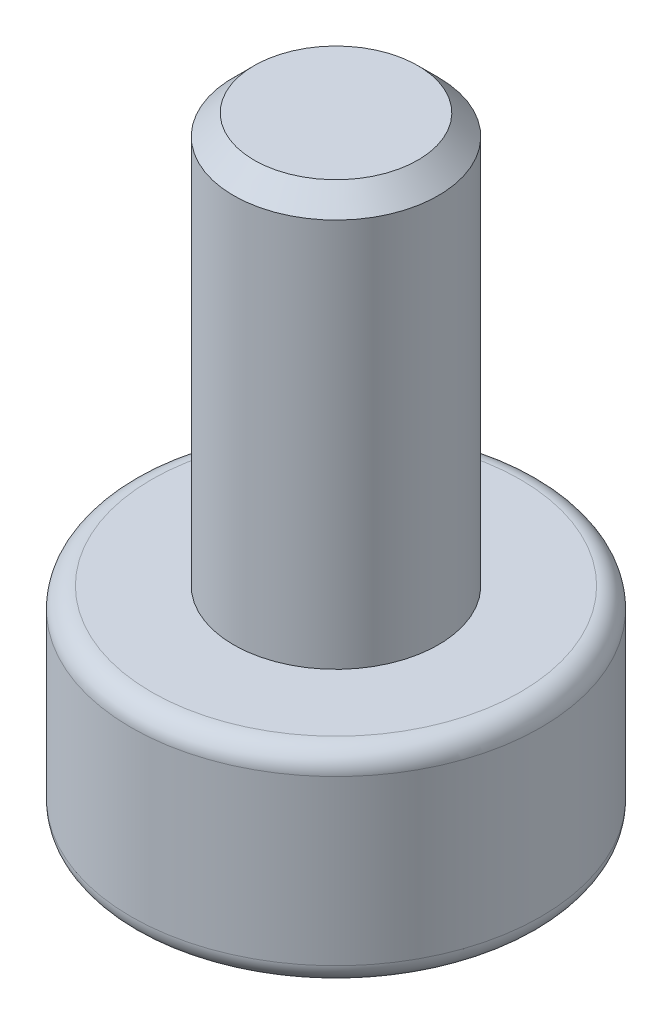
ISO-10303-21;
HEADER;
FILE_DESCRIPTION(('STEP AP214'),'2;1');
FILE_NAME('part.step','',(''),(''),'','','');
FILE_SCHEMA(('AUTOMOTIVE_DESIGN { 1 0 10303 214 1 1 1 1 }'));
ENDSEC;
DATA;
#1=APPLICATION_CONTEXT('core data for automotive mechanical design processes');
#2=APPLICATION_PROTOCOL_DEFINITION('international standard','automotive_design',2000,#1);
#3=PRODUCT_CONTEXT('',#1,'mechanical');
#4=PRODUCT('Part','Part','',(#3));
#5=PRODUCT_RELATED_PRODUCT_CATEGORY('part','',(#4));
#6=PRODUCT_DEFINITION_FORMATION('','',#4);
#7=PRODUCT_DEFINITION_CONTEXT('part definition',#1,'design');
#8=PRODUCT_DEFINITION('design','',#6,#7);
#9=PRODUCT_DEFINITION_SHAPE('','',#8);
#10=(LENGTH_UNIT() NAMED_UNIT(*) SI_UNIT(.MILLI.,.METRE.));
#11=(NAMED_UNIT(*) PLANE_ANGLE_UNIT() SI_UNIT($,.RADIAN.));
#12=(NAMED_UNIT(*) SI_UNIT($,.STERADIAN.) SOLID_ANGLE_UNIT());
#13=UNCERTAINTY_MEASURE_WITH_UNIT(LENGTH_MEASURE(1.E-05),#10,'distance_accuracy_value','');
#14=(GEOMETRIC_REPRESENTATION_CONTEXT(3) GLOBAL_UNCERTAINTY_ASSIGNED_CONTEXT((#13)) GLOBAL_UNIT_ASSIGNED_CONTEXT((#10,
#11,#12)) REPRESENTATION_CONTEXT('',''));
#15=CARTESIAN_POINT('',(0.,0.,0.));
#16=DIRECTION('',(0.,0.,1.));
#17=DIRECTION('',(1.,0.,0.));
#18=AXIS2_PLACEMENT_3D('',#15,#16,#17);
#19=CARTESIAN_POINT('',(0.,2.,0.));
#20=DIRECTION('',(0.,-1.,0.));
#21=DIRECTION('',(0.,0.,-1.));
#22=AXIS2_PLACEMENT_3D('',#19,#20,#21);
#23=CYLINDRICAL_SURFACE('',#22,2.);
#24=CARTESIAN_POINT('',(0.,0.2,0.));
#25=DIRECTION('',(0.,1.,0.));
#26=DIRECTION('',(0.,0.,1.));
#27=AXIS2_PLACEMENT_3D('',#24,#25,#26);
#28=CIRCLE('',#27,2.);
#29=CARTESIAN_POINT('',(0.,0.2,2.));
#30=VERTEX_POINT('',#29);
#31=EDGE_CURVE('E72',#30,#30,#28,.T.);
#32=ORIENTED_EDGE('',*,*,#31,.T.);
#33=EDGE_LOOP('',(#32));
#34=FACE_BOUND('',#33,.T.);
#35=CARTESIAN_POINT('',(0.,1.8,0.));
#36=DIRECTION('',(0.,1.,0.));
#37=DIRECTION('',(0.,0.,1.));
#38=AXIS2_PLACEMENT_3D('',#35,#36,#37);
#39=CIRCLE('',#38,2.);
#40=CARTESIAN_POINT('',(0.,1.8,2.));
#41=VERTEX_POINT('',#40);
#42=EDGE_CURVE('E76',#41,#41,#39,.F.);
#43=ORIENTED_EDGE('',*,*,#42,.T.);
#44=EDGE_LOOP('',(#43));
#45=FACE_BOUND('',#44,.T.);
#46=ADVANCED_FACE('F39',(#34,#45),#23,.T.);
#47=CARTESIAN_POINT('',(0.,2.,0.));
#48=DIRECTION('',(0.,1.,0.));
#49=DIRECTION('',(0.,0.,1.));
#50=AXIS2_PLACEMENT_3D('',#47,#48,#49);
#51=PLANE('',#50);
#52=CARTESIAN_POINT('',(0.,2.,0.));
#53=DIRECTION('',(0.,1.,0.));
#54=DIRECTION('',(0.,0.,1.));
#55=AXIS2_PLACEMENT_3D('',#52,#53,#54);
#56=CIRCLE('',#55,1.8);
#57=CARTESIAN_POINT('',(0.,2.,1.8));
#58=VERTEX_POINT('',#57);
#59=EDGE_CURVE('E64',#58,#58,#56,.T.);
#60=ORIENTED_EDGE('',*,*,#59,.T.);
#61=EDGE_LOOP('',(#60));
#62=FACE_BOUND('',#61,.T.);
#63=CARTESIAN_POINT('',(0.,2.,0.));
#64=DIRECTION('',(0.,1.,0.));
#65=DIRECTION('',(0.,0.,1.));
#66=AXIS2_PLACEMENT_3D('',#63,#64,#65);
#67=CIRCLE('',#66,1.);
#68=CARTESIAN_POINT('',(0.,2.,1.));
#69=VERTEX_POINT('',#68);
#70=EDGE_CURVE('E80',#69,#69,#67,.T.);
#71=ORIENTED_EDGE('',*,*,#70,.F.);
#72=EDGE_LOOP('',(#71));
#73=FACE_BOUND('',#72,.T.);
#74=ADVANCED_FACE('F107',(#62,#73),#51,.T.);
#75=CARTESIAN_POINT('',(0.,0.,0.));
#76=DIRECTION('',(0.,1.,0.));
#77=DIRECTION('',(0.,0.,1.));
#78=AXIS2_PLACEMENT_3D('',#75,#76,#77);
#79=PLANE('',#78);
#80=CARTESIAN_POINT('',(0.,0.,0.));
#81=DIRECTION('',(0.,1.,0.));
#82=DIRECTION('',(0.,0.,1.));
#83=AXIS2_PLACEMENT_3D('',#80,#81,#82);
#84=CIRCLE('',#83,0.864999999999999);
#85=CARTESIAN_POINT('',(0.,0.,0.864999999999999));
#86=VERTEX_POINT('',#85);
#87=EDGE_CURVE('E53',#86,#86,#84,.T.);
#88=ORIENTED_EDGE('',*,*,#87,.T.);
#89=EDGE_LOOP('',(#88));
#90=FACE_BOUND('',#89,.T.);
#91=CARTESIAN_POINT('',(0.,0.,0.));
#92=DIRECTION('',(0.,1.,0.));
#93=DIRECTION('',(0.,0.,1.));
#94=AXIS2_PLACEMENT_3D('',#91,#92,#93);
#95=CIRCLE('',#94,1.8);
#96=CARTESIAN_POINT('',(0.,0.,1.8));
#97=VERTEX_POINT('',#96);
#98=EDGE_CURVE('E68',#97,#97,#95,.F.);
#99=ORIENTED_EDGE('',*,*,#98,.T.);
#100=EDGE_LOOP('',(#99));
#101=FACE_BOUND('',#100,.T.);
#102=ADVANCED_FACE('F113',(#90,#101),#79,.F.);
#103=CARTESIAN_POINT('',(0.,6.,0.));
#104=DIRECTION('',(0.,-1.,0.));
#105=DIRECTION('',(0.,0.,-1.));
#106=AXIS2_PLACEMENT_3D('',#103,#104,#105);
#107=CYLINDRICAL_SURFACE('',#106,1.);
#108=CARTESIAN_POINT('',(0.,5.8,0.));
#109=DIRECTION('',(0.,1.,0.));
#110=DIRECTION('',(0.,0.,1.));
#111=AXIS2_PLACEMENT_3D('',#108,#109,#110);
#112=CIRCLE('',#111,1.);
#113=CARTESIAN_POINT('',(0.,5.8,1.));
#114=VERTEX_POINT('',#113);
#115=EDGE_CURVE('E10',#114,#114,#112,.F.);
#116=ORIENTED_EDGE('',*,*,#115,.T.);
#117=EDGE_LOOP('',(#116));
#118=FACE_BOUND('',#117,.T.);
#119=ORIENTED_EDGE('',*,*,#70,.T.);
#120=EDGE_LOOP('',(#119));
#121=FACE_BOUND('',#120,.T.);
#122=ADVANCED_FACE('F137',(#118,#121),#107,.T.);
#123=CARTESIAN_POINT('',(0.,6.,0.));
#124=DIRECTION('',(0.,1.,0.));
#125=DIRECTION('',(0.,0.,1.));
#126=AXIS2_PLACEMENT_3D('',#123,#124,#125);
#127=PLANE('',#126);
#128=CARTESIAN_POINT('',(0.,6.,0.));
#129=DIRECTION('',(0.,1.,0.));
#130=DIRECTION('',(0.,0.,1.));
#131=AXIS2_PLACEMENT_3D('',#128,#129,#130);
#132=CIRCLE('',#131,0.800000000000002);
#133=CARTESIAN_POINT('',(0.,6.,0.800000000000002));
#134=VERTEX_POINT('',#133);
#135=EDGE_CURVE('E48',#134,#134,#132,.T.);
#136=ORIENTED_EDGE('',*,*,#135,.T.);
#137=EDGE_LOOP('',(#136));
#138=FACE_BOUND('',#137,.T.);
#139=ADVANCED_FACE('F120',(#138),#127,.T.);
#140=CARTESIAN_POINT('',(0.,0.2,0.));
#141=DIRECTION('',(0.,1.,0.));
#142=DIRECTION('',(0.,0.,1.));
#143=AXIS2_PLACEMENT_3D('',#140,#141,#142);
#144=TOROIDAL_SURFACE('',#143,1.8,0.2);
#145=ORIENTED_EDGE('',*,*,#98,.F.);
#146=EDGE_LOOP('',(#145));
#147=FACE_BOUND('',#146,.T.);
#148=ORIENTED_EDGE('',*,*,#31,.F.);
#149=EDGE_LOOP('',(#148));
#150=FACE_BOUND('',#149,.T.);
#151=ADVANCED_FACE('F102',(#147,#150),#144,.T.);
#152=CARTESIAN_POINT('',(0.,1.8,0.));
#153=DIRECTION('',(0.,1.,0.));
#154=DIRECTION('',(0.,0.,1.));
#155=AXIS2_PLACEMENT_3D('',#152,#153,#154);
#156=TOROIDAL_SURFACE('',#155,1.8,0.2);
#157=ORIENTED_EDGE('',*,*,#42,.F.);
#158=EDGE_LOOP('',(#157));
#159=FACE_BOUND('',#158,.T.);
#160=ORIENTED_EDGE('',*,*,#59,.F.);
#161=EDGE_LOOP('',(#160));
#162=FACE_BOUND('',#161,.T.);
#163=ADVANCED_FACE('F93',(#159,#162),#156,.T.);
#164=CARTESIAN_POINT('',(0.,1.52,0.));
#165=DIRECTION('',(0.,-1.,0.));
#166=DIRECTION('',(0.,0.,-1.));
#167=AXIS2_PLACEMENT_3D('',#164,#165,#166);
#168=CYLINDRICAL_SURFACE('',#167,0.765);
#169=CARTESIAN_POINT('',(0.,0.0999999999999985,0.));
#170=DIRECTION('',(0.,1.,0.));
#171=DIRECTION('',(0.,0.,1.));
#172=AXIS2_PLACEMENT_3D('',#169,#170,#171);
#173=CIRCLE('',#172,0.765);
#174=CARTESIAN_POINT('',(0.,0.0999999999999985,0.765));
#175=VERTEX_POINT('',#174);
#176=EDGE_CURVE('E58',#175,#175,#173,.F.);
#177=ORIENTED_EDGE('',*,*,#176,.T.);
#178=EDGE_LOOP('',(#177));
#179=FACE_BOUND('',#178,.T.);
#180=CARTESIAN_POINT('',(0.,1.52,0.));
#181=DIRECTION('',(0.,-1.,0.));
#182=DIRECTION('',(0.,0.,-1.));
#183=AXIS2_PLACEMENT_3D('',#180,#181,#182);
#184=CIRCLE('',#183,0.765);
#185=CARTESIAN_POINT('',(0.,1.52,-0.765));
#186=VERTEX_POINT('',#185);
#187=EDGE_CURVE('E84',#186,#186,#184,.T.);
#188=ORIENTED_EDGE('',*,*,#187,.F.);
#189=EDGE_LOOP('',(#188));
#190=FACE_BOUND('',#189,.T.);
#191=ADVANCED_FACE('F91',(#179,#190),#168,.F.);
#192=CARTESIAN_POINT('',(0.,1.52,0.));
#193=DIRECTION('',(0.,-1.,0.));
#194=DIRECTION('',(0.,0.,-1.));
#195=AXIS2_PLACEMENT_3D('',#192,#193,#194);
#196=PLANE('',#195);
#197=ORIENTED_EDGE('',*,*,#187,.T.);
#198=EDGE_LOOP('',(#197));
#199=FACE_BOUND('',#198,.T.);
#200=ADVANCED_FACE('F89',(#199),#196,.T.);
#201=CARTESIAN_POINT('',(0.,0.0999999999999985,0.));
#202=DIRECTION('',(0.,-1.,0.));
#203=DIRECTION('',(0.,0.,-1.));
#204=AXIS2_PLACEMENT_3D('',#201,#202,#203);
#205=CONICAL_SURFACE('',#204,0.765,0.785398163397452);
#206=ORIENTED_EDGE('',*,*,#87,.F.);
#207=EDGE_LOOP('',(#206));
#208=FACE_BOUND('',#207,.T.);
#209=ORIENTED_EDGE('',*,*,#176,.F.);
#210=EDGE_LOOP('',(#209));
#211=FACE_BOUND('',#210,.T.);
#212=ADVANCED_FACE('F100',(#208,#211),#205,.F.);
#213=CARTESIAN_POINT('',(0.,6.,0.));
#214=DIRECTION('',(0.,-1.,0.));
#215=DIRECTION('',(0.,0.,-1.));
#216=AXIS2_PLACEMENT_3D('',#213,#214,#215);
#217=CONICAL_SURFACE('',#216,0.800000000000002,0.785398163397448);
#218=ORIENTED_EDGE('',*,*,#115,.F.);
#219=EDGE_LOOP('',(#218));
#220=FACE_BOUND('',#219,.T.);
#221=ORIENTED_EDGE('',*,*,#135,.F.);
#222=EDGE_LOOP('',(#221));
#223=FACE_BOUND('',#222,.T.);
#224=ADVANCED_FACE('F42',(#220,#223),#217,.T.);
#225=CLOSED_SHELL('',(#46,#74,#102,#122,#139,#151,#163,#191,#200,#212,#224));
#226=MANIFOLD_SOLID_BREP('B2',#225);
#227=ADVANCED_BREP_SHAPE_REPRESENTATION('',(#18,#226),#14);
#228=SHAPE_DEFINITION_REPRESENTATION(#9,#227);
ENDSEC;
END-ISO-10303-21;
